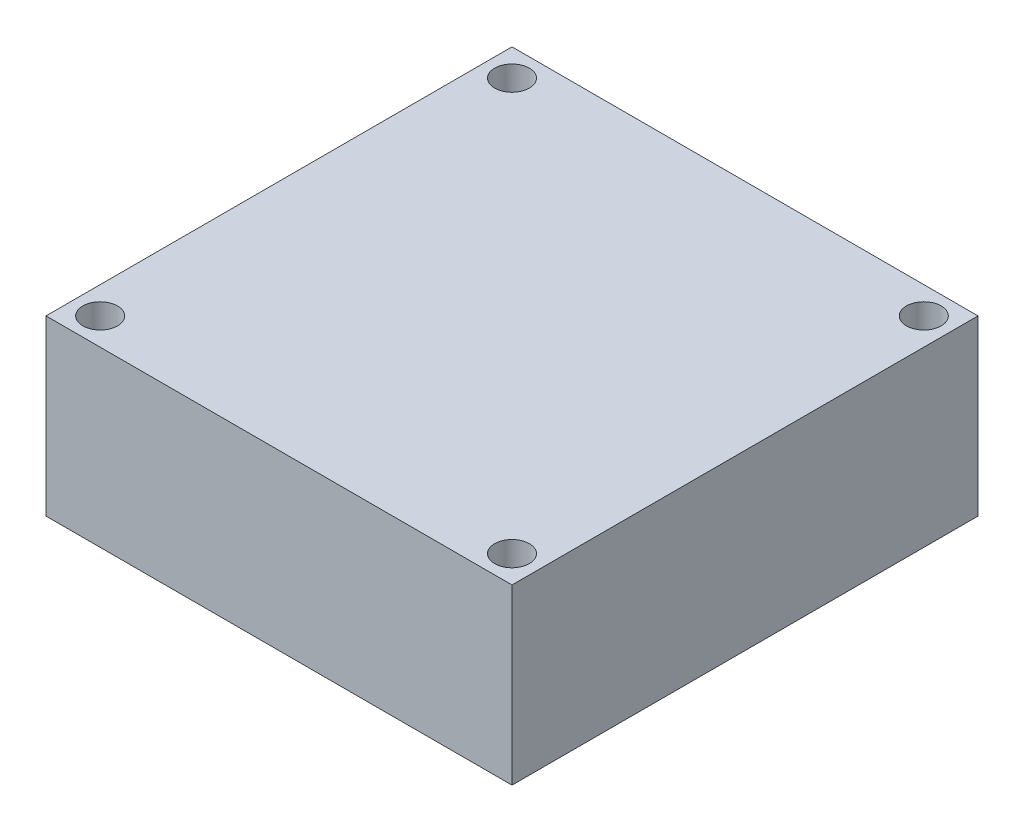
ISO-10303-21;
HEADER;
FILE_DESCRIPTION(('STEP AP214'),'2;1');
FILE_NAME('part.step','',(''),(''),'','','');
FILE_SCHEMA(('AUTOMOTIVE_DESIGN { 1 0 10303 214 1 1 1 1 }'));
ENDSEC;
DATA;
#1=APPLICATION_CONTEXT('core data for automotive mechanical design processes');
#2=APPLICATION_PROTOCOL_DEFINITION('international standard','automotive_design',2000,#1);
#3=PRODUCT_CONTEXT('',#1,'mechanical');
#4=PRODUCT('Part','Part','',(#3));
#5=PRODUCT_RELATED_PRODUCT_CATEGORY('part','',(#4));
#6=PRODUCT_DEFINITION_FORMATION('','',#4);
#7=PRODUCT_DEFINITION_CONTEXT('part definition',#1,'design');
#8=PRODUCT_DEFINITION('design','',#6,#7);
#9=PRODUCT_DEFINITION_SHAPE('','',#8);
#10=(LENGTH_UNIT() NAMED_UNIT(*) SI_UNIT(.MILLI.,.METRE.));
#11=(NAMED_UNIT(*) PLANE_ANGLE_UNIT() SI_UNIT($,.RADIAN.));
#12=(NAMED_UNIT(*) SI_UNIT($,.STERADIAN.) SOLID_ANGLE_UNIT());
#13=UNCERTAINTY_MEASURE_WITH_UNIT(LENGTH_MEASURE(1.E-05),#10,'distance_accuracy_value','');
#14=(GEOMETRIC_REPRESENTATION_CONTEXT(3) GLOBAL_UNCERTAINTY_ASSIGNED_CONTEXT((#13)) GLOBAL_UNIT_ASSIGNED_CONTEXT((#10,
#11,#12)) REPRESENTATION_CONTEXT('',''));
#15=CARTESIAN_POINT('',(0.,0.,0.));
#16=DIRECTION('',(0.,0.,1.));
#17=DIRECTION('',(1.,0.,0.));
#18=AXIS2_PLACEMENT_3D('',#15,#16,#17);
#19=CARTESIAN_POINT('',(0.,16.,0.));
#20=DIRECTION('',(0.,-1.,0.));
#21=DIRECTION('',(0.,0.,-1.));
#22=AXIS2_PLACEMENT_3D('',#19,#20,#21);
#23=PLANE('',#22);
#24=CARTESIAN_POINT('',(-19.,16.,-19.));
#25=DIRECTION('',(0.,1.,0.));
#26=DIRECTION('',(0.,0.,1.));
#27=AXIS2_PLACEMENT_3D('',#24,#25,#26);
#28=CIRCLE('',#27,1.59999999999999);
#29=CARTESIAN_POINT('',(-19.,16.,-17.4));
#30=VERTEX_POINT('',#29);
#31=EDGE_CURVE('E138',#30,#30,#28,.T.);
#32=ORIENTED_EDGE('',*,*,#31,.F.);
#33=EDGE_LOOP('',(#32));
#34=FACE_BOUND('',#33,.T.);
#35=CARTESIAN_POINT('',(19.,16.,-19.));
#36=DIRECTION('',(0.,1.,0.));
#37=DIRECTION('',(0.,0.,1.));
#38=AXIS2_PLACEMENT_3D('',#35,#36,#37);
#39=CIRCLE('',#38,1.59999999999999);
#40=CARTESIAN_POINT('',(19.,16.,-17.4));
#41=VERTEX_POINT('',#40);
#42=EDGE_CURVE('E132',#41,#41,#39,.T.);
#43=ORIENTED_EDGE('',*,*,#42,.F.);
#44=EDGE_LOOP('',(#43));
#45=FACE_BOUND('',#44,.T.);
#46=CARTESIAN_POINT('',(-19.,16.,19.));
#47=DIRECTION('',(0.,1.,0.));
#48=DIRECTION('',(0.,0.,1.));
#49=AXIS2_PLACEMENT_3D('',#46,#47,#48);
#50=CIRCLE('',#49,1.59999999999999);
#51=CARTESIAN_POINT('',(-19.,16.,20.6));
#52=VERTEX_POINT('',#51);
#53=EDGE_CURVE('E120',#52,#52,#50,.T.);
#54=ORIENTED_EDGE('',*,*,#53,.F.);
#55=EDGE_LOOP('',(#54));
#56=FACE_BOUND('',#55,.T.);
#57=DIRECTION('',(0.,0.,-1.));
#58=VECTOR('',#57,1.);
#59=CARTESIAN_POINT('',(21.5,16.,21.5));
#60=LINE('',#59,#58);
#61=CARTESIAN_POINT('',(21.5,16.,21.5));
#62=VERTEX_POINT('',#61);
#63=CARTESIAN_POINT('',(21.5,16.,-21.5));
#64=VERTEX_POINT('',#63);
#65=EDGE_CURVE('E91',#62,#64,#60,.T.);
#66=ORIENTED_EDGE('',*,*,#65,.T.);
#67=DIRECTION('',(-1.,0.,0.));
#68=VECTOR('',#67,1.);
#69=CARTESIAN_POINT('',(-21.5,16.,-21.5));
#70=LINE('',#69,#68);
#71=CARTESIAN_POINT('',(-21.5,16.,-21.5));
#72=VERTEX_POINT('',#71);
#73=EDGE_CURVE('E86',#64,#72,#70,.T.);
#74=ORIENTED_EDGE('',*,*,#73,.T.);
#75=DIRECTION('',(0.,0.,1.));
#76=VECTOR('',#75,1.);
#77=CARTESIAN_POINT('',(-21.5,16.,21.5));
#78=LINE('',#77,#76);
#79=CARTESIAN_POINT('',(-21.5,16.,21.5));
#80=VERTEX_POINT('',#79);
#81=EDGE_CURVE('E89',#72,#80,#78,.T.);
#82=ORIENTED_EDGE('',*,*,#81,.T.);
#83=DIRECTION('',(1.,0.,0.));
#84=VECTOR('',#83,1.);
#85=CARTESIAN_POINT('',(-21.5,16.,21.5));
#86=LINE('',#85,#84);
#87=EDGE_CURVE('E56',#80,#62,#86,.T.);
#88=ORIENTED_EDGE('',*,*,#87,.T.);
#89=EDGE_LOOP('',(#66,#74,#82,#88));
#90=FACE_BOUND('',#89,.T.);
#91=CARTESIAN_POINT('',(19.,16.,19.));
#92=DIRECTION('',(0.,1.,0.));
#93=DIRECTION('',(0.,0.,1.));
#94=AXIS2_PLACEMENT_3D('',#91,#92,#93);
#95=CIRCLE('',#94,1.59999999999999);
#96=CARTESIAN_POINT('',(19.,16.,20.6));
#97=VERTEX_POINT('',#96);
#98=EDGE_CURVE('E126',#97,#97,#95,.T.);
#99=ORIENTED_EDGE('',*,*,#98,.F.);
#100=EDGE_LOOP('',(#99));
#101=FACE_BOUND('',#100,.T.);
#102=ADVANCED_FACE('F39',(#34,#45,#56,#90,#101),#23,.F.);
#103=CARTESIAN_POINT('',(0.,0.,0.));
#104=DIRECTION('',(0.,-1.,0.));
#105=DIRECTION('',(0.,0.,-1.));
#106=AXIS2_PLACEMENT_3D('',#103,#104,#105);
#107=PLANE('',#106);
#108=CARTESIAN_POINT('',(-19.,0.,-19.));
#109=DIRECTION('',(0.,1.,0.));
#110=DIRECTION('',(0.,0.,1.));
#111=AXIS2_PLACEMENT_3D('',#108,#109,#110);
#112=CIRCLE('',#111,1.6);
#113=CARTESIAN_POINT('',(-19.,0.,-17.4));
#114=VERTEX_POINT('',#113);
#115=EDGE_CURVE('E135',#114,#114,#112,.T.);
#116=ORIENTED_EDGE('',*,*,#115,.T.);
#117=EDGE_LOOP('',(#116));
#118=FACE_BOUND('',#117,.T.);
#119=CARTESIAN_POINT('',(19.,0.,-19.));
#120=DIRECTION('',(0.,1.,0.));
#121=DIRECTION('',(0.,0.,1.));
#122=AXIS2_PLACEMENT_3D('',#119,#120,#121);
#123=CIRCLE('',#122,1.6);
#124=CARTESIAN_POINT('',(19.,0.,-17.4));
#125=VERTEX_POINT('',#124);
#126=EDGE_CURVE('E129',#125,#125,#123,.T.);
#127=ORIENTED_EDGE('',*,*,#126,.T.);
#128=EDGE_LOOP('',(#127));
#129=FACE_BOUND('',#128,.T.);
#130=CARTESIAN_POINT('',(19.,0.,19.));
#131=DIRECTION('',(0.,1.,0.));
#132=DIRECTION('',(0.,0.,1.));
#133=AXIS2_PLACEMENT_3D('',#130,#131,#132);
#134=CIRCLE('',#133,1.6);
#135=CARTESIAN_POINT('',(19.,0.,20.6));
#136=VERTEX_POINT('',#135);
#137=EDGE_CURVE('E123',#136,#136,#134,.T.);
#138=ORIENTED_EDGE('',*,*,#137,.T.);
#139=EDGE_LOOP('',(#138));
#140=FACE_BOUND('',#139,.T.);
#141=DIRECTION('',(0.,0.,-1.));
#142=VECTOR('',#141,1.);
#143=CARTESIAN_POINT('',(21.5,0.,21.5));
#144=LINE('',#143,#142);
#145=CARTESIAN_POINT('',(21.5,0.,21.5));
#146=VERTEX_POINT('',#145);
#147=CARTESIAN_POINT('',(21.5,0.,-21.5));
#148=VERTEX_POINT('',#147);
#149=EDGE_CURVE('E103',#146,#148,#144,.T.);
#150=ORIENTED_EDGE('',*,*,#149,.F.);
#151=DIRECTION('',(1.,0.,0.));
#152=VECTOR('',#151,1.);
#153=CARTESIAN_POINT('',(-21.5,0.,21.5));
#154=LINE('',#153,#152);
#155=CARTESIAN_POINT('',(-21.5,0.,21.5));
#156=VERTEX_POINT('',#155);
#157=EDGE_CURVE('E79',#156,#146,#154,.T.);
#158=ORIENTED_EDGE('',*,*,#157,.F.);
#159=DIRECTION('',(0.,0.,1.));
#160=VECTOR('',#159,1.);
#161=CARTESIAN_POINT('',(-21.5,0.,21.5));
#162=LINE('',#161,#160);
#163=CARTESIAN_POINT('',(-21.5,0.,-21.5));
#164=VERTEX_POINT('',#163);
#165=EDGE_CURVE('E73',#164,#156,#162,.T.);
#166=ORIENTED_EDGE('',*,*,#165,.F.);
#167=DIRECTION('',(-1.,0.,0.));
#168=VECTOR('',#167,1.);
#169=CARTESIAN_POINT('',(-21.5,0.,-21.5));
#170=LINE('',#169,#168);
#171=EDGE_CURVE('E95',#148,#164,#170,.T.);
#172=ORIENTED_EDGE('',*,*,#171,.F.);
#173=EDGE_LOOP('',(#150,#158,#166,#172));
#174=FACE_BOUND('',#173,.T.);
#175=CARTESIAN_POINT('',(-19.,0.,19.));
#176=DIRECTION('',(0.,1.,0.));
#177=DIRECTION('',(0.,0.,1.));
#178=AXIS2_PLACEMENT_3D('',#175,#176,#177);
#179=CIRCLE('',#178,1.6);
#180=CARTESIAN_POINT('',(-19.,0.,20.6));
#181=VERTEX_POINT('',#180);
#182=EDGE_CURVE('E106',#181,#181,#179,.T.);
#183=ORIENTED_EDGE('',*,*,#182,.T.);
#184=EDGE_LOOP('',(#183));
#185=FACE_BOUND('',#184,.T.);
#186=ADVANCED_FACE('F114',(#118,#129,#140,#174,#185),#107,.T.);
#187=CARTESIAN_POINT('',(21.5,16.,21.5));
#188=DIRECTION('',(-1.,0.,0.));
#189=DIRECTION('',(0.,0.,1.));
#190=AXIS2_PLACEMENT_3D('',#187,#188,#189);
#191=PLANE('',#190);
#192=ORIENTED_EDGE('',*,*,#149,.T.);
#193=DIRECTION('',(0.,-1.,0.));
#194=VECTOR('',#193,1.);
#195=CARTESIAN_POINT('',(21.5,16.,-21.5));
#196=LINE('',#195,#194);
#197=EDGE_CURVE('E11',#64,#148,#196,.T.);
#198=ORIENTED_EDGE('',*,*,#197,.F.);
#199=ORIENTED_EDGE('',*,*,#65,.F.);
#200=DIRECTION('',(0.,-1.,0.));
#201=VECTOR('',#200,1.);
#202=CARTESIAN_POINT('',(21.5,16.,21.5));
#203=LINE('',#202,#201);
#204=EDGE_CURVE('E99',#62,#146,#203,.T.);
#205=ORIENTED_EDGE('',*,*,#204,.T.);
#206=EDGE_LOOP('',(#192,#198,#199,#205));
#207=FACE_BOUND('',#206,.T.);
#208=ADVANCED_FACE('F41',(#207),#191,.F.);
#209=CARTESIAN_POINT('',(-21.5,16.,-21.5));
#210=DIRECTION('',(0.,0.,1.));
#211=DIRECTION('',(1.,0.,0.));
#212=AXIS2_PLACEMENT_3D('',#209,#210,#211);
#213=PLANE('',#212);
#214=ORIENTED_EDGE('',*,*,#171,.T.);
#215=DIRECTION('',(0.,-1.,0.));
#216=VECTOR('',#215,1.);
#217=CARTESIAN_POINT('',(-21.5,16.,-21.5));
#218=LINE('',#217,#216);
#219=EDGE_CURVE('E48',#72,#164,#218,.T.);
#220=ORIENTED_EDGE('',*,*,#219,.F.);
#221=ORIENTED_EDGE('',*,*,#73,.F.);
#222=ORIENTED_EDGE('',*,*,#197,.T.);
#223=EDGE_LOOP('',(#214,#220,#221,#222));
#224=FACE_BOUND('',#223,.T.);
#225=ADVANCED_FACE('F94',(#224),#213,.F.);
#226=CARTESIAN_POINT('',(-21.5,16.,21.5));
#227=DIRECTION('',(1.,0.,0.));
#228=DIRECTION('',(0.,0.,-1.));
#229=AXIS2_PLACEMENT_3D('',#226,#227,#228);
#230=PLANE('',#229);
#231=ORIENTED_EDGE('',*,*,#165,.T.);
#232=DIRECTION('',(0.,-1.,0.));
#233=VECTOR('',#232,1.);
#234=CARTESIAN_POINT('',(-21.5,16.,21.5));
#235=LINE('',#234,#233);
#236=EDGE_CURVE('E96',#80,#156,#235,.T.);
#237=ORIENTED_EDGE('',*,*,#236,.F.);
#238=ORIENTED_EDGE('',*,*,#81,.F.);
#239=ORIENTED_EDGE('',*,*,#219,.T.);
#240=EDGE_LOOP('',(#231,#237,#238,#239));
#241=FACE_BOUND('',#240,.T.);
#242=ADVANCED_FACE('F97',(#241),#230,.F.);
#243=CARTESIAN_POINT('',(-21.5,16.,21.5));
#244=DIRECTION('',(0.,0.,-1.));
#245=DIRECTION('',(-1.,0.,0.));
#246=AXIS2_PLACEMENT_3D('',#243,#244,#245);
#247=PLANE('',#246);
#248=ORIENTED_EDGE('',*,*,#157,.T.);
#249=ORIENTED_EDGE('',*,*,#204,.F.);
#250=ORIENTED_EDGE('',*,*,#87,.F.);
#251=ORIENTED_EDGE('',*,*,#236,.T.);
#252=EDGE_LOOP('',(#248,#249,#250,#251));
#253=FACE_BOUND('',#252,.T.);
#254=ADVANCED_FACE('F111',(#253),#247,.F.);
#255=CARTESIAN_POINT('',(-19.,16.,19.));
#256=DIRECTION('',(0.,1.,0.));
#257=DIRECTION('',(0.,0.,1.));
#258=AXIS2_PLACEMENT_3D('',#255,#256,#257);
#259=CYLINDRICAL_SURFACE('',#258,1.59999999999999);
#260=ORIENTED_EDGE('',*,*,#182,.F.);
#261=EDGE_LOOP('',(#260));
#262=FACE_BOUND('',#261,.T.);
#263=ORIENTED_EDGE('',*,*,#53,.T.);
#264=EDGE_LOOP('',(#263));
#265=FACE_BOUND('',#264,.T.);
#266=ADVANCED_FACE('F151',(#262,#265),#259,.F.);
#267=CARTESIAN_POINT('',(19.,16.,19.));
#268=DIRECTION('',(0.,1.,0.));
#269=DIRECTION('',(0.,0.,1.));
#270=AXIS2_PLACEMENT_3D('',#267,#268,#269);
#271=CYLINDRICAL_SURFACE('',#270,1.59999999999999);
#272=ORIENTED_EDGE('',*,*,#137,.F.);
#273=EDGE_LOOP('',(#272));
#274=FACE_BOUND('',#273,.T.);
#275=ORIENTED_EDGE('',*,*,#98,.T.);
#276=EDGE_LOOP('',(#275));
#277=FACE_BOUND('',#276,.T.);
#278=ADVANCED_FACE('F153',(#274,#277),#271,.F.);
#279=CARTESIAN_POINT('',(19.,16.,-19.));
#280=DIRECTION('',(0.,1.,0.));
#281=DIRECTION('',(0.,0.,1.));
#282=AXIS2_PLACEMENT_3D('',#279,#280,#281);
#283=CYLINDRICAL_SURFACE('',#282,1.59999999999999);
#284=ORIENTED_EDGE('',*,*,#126,.F.);
#285=EDGE_LOOP('',(#284));
#286=FACE_BOUND('',#285,.T.);
#287=ORIENTED_EDGE('',*,*,#42,.T.);
#288=EDGE_LOOP('',(#287));
#289=FACE_BOUND('',#288,.T.);
#290=ADVANCED_FACE('F160',(#286,#289),#283,.F.);
#291=CARTESIAN_POINT('',(-19.,16.,-19.));
#292=DIRECTION('',(0.,1.,0.));
#293=DIRECTION('',(0.,0.,1.));
#294=AXIS2_PLACEMENT_3D('',#291,#292,#293);
#295=CYLINDRICAL_SURFACE('',#294,1.59999999999999);
#296=ORIENTED_EDGE('',*,*,#115,.F.);
#297=EDGE_LOOP('',(#296));
#298=FACE_BOUND('',#297,.T.);
#299=ORIENTED_EDGE('',*,*,#31,.T.);
#300=EDGE_LOOP('',(#299));
#301=FACE_BOUND('',#300,.T.);
#302=ADVANCED_FACE('F142',(#298,#301),#295,.F.);
#303=CLOSED_SHELL('',(#102,#186,#208,#225,#242,#254,#266,#278,#290,#302));
#304=MANIFOLD_SOLID_BREP('B2',#303);
#305=ADVANCED_BREP_SHAPE_REPRESENTATION('',(#18,#304),#14);
#306=SHAPE_DEFINITION_REPRESENTATION(#9,#305);
ENDSEC;
END-ISO-10303-21;
